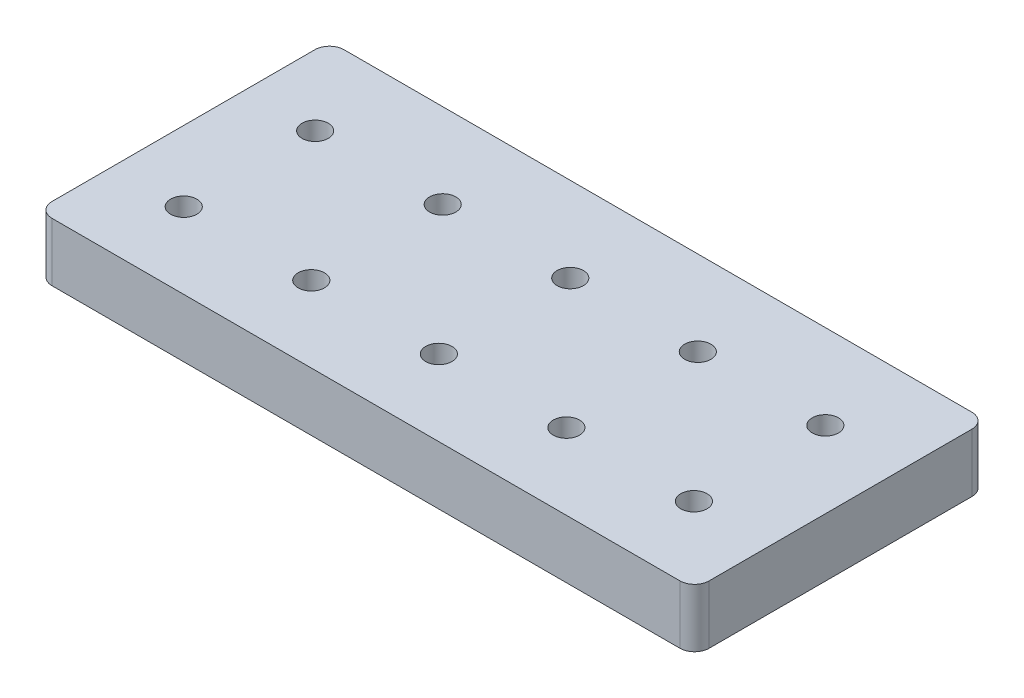
ISO-10303-21;
HEADER;
FILE_DESCRIPTION(('STEP AP214'),'2;1');
FILE_NAME('part.step','',(''),(''),'','','');
FILE_SCHEMA(('AUTOMOTIVE_DESIGN { 1 0 10303 214 1 1 1 1 }'));
ENDSEC;
DATA;
#1=APPLICATION_CONTEXT('core data for automotive mechanical design processes');
#2=APPLICATION_PROTOCOL_DEFINITION('international standard','automotive_design',2000,#1);
#3=PRODUCT_CONTEXT('',#1,'mechanical');
#4=PRODUCT('Part','Part','',(#3));
#5=PRODUCT_RELATED_PRODUCT_CATEGORY('part','',(#4));
#6=PRODUCT_DEFINITION_FORMATION('','',#4);
#7=PRODUCT_DEFINITION_CONTEXT('part definition',#1,'design');
#8=PRODUCT_DEFINITION('design','',#6,#7);
#9=PRODUCT_DEFINITION_SHAPE('','',#8);
#10=(LENGTH_UNIT() NAMED_UNIT(*) SI_UNIT(.MILLI.,.METRE.));
#11=(NAMED_UNIT(*) PLANE_ANGLE_UNIT() SI_UNIT($,.RADIAN.));
#12=(NAMED_UNIT(*) SI_UNIT($,.STERADIAN.) SOLID_ANGLE_UNIT());
#13=UNCERTAINTY_MEASURE_WITH_UNIT(LENGTH_MEASURE(1.E-05),#10,'distance_accuracy_value','');
#14=(GEOMETRIC_REPRESENTATION_CONTEXT(3) GLOBAL_UNCERTAINTY_ASSIGNED_CONTEXT((#13)) GLOBAL_UNIT_ASSIGNED_CONTEXT((#10,
#11,#12)) REPRESENTATION_CONTEXT('',''));
#15=CARTESIAN_POINT('',(0.,0.,0.));
#16=DIRECTION('',(0.,0.,1.));
#17=DIRECTION('',(1.,0.,0.));
#18=AXIS2_PLACEMENT_3D('',#15,#16,#17);
#19=CARTESIAN_POINT('',(-12.7,50.8,-12.7));
#20=DIRECTION('',(0.,-1.,0.));
#21=DIRECTION('',(0.,0.,-1.));
#22=AXIS2_PLACEMENT_3D('',#19,#20,#21);
#23=CYLINDRICAL_SURFACE('',#22,12.7);
#24=CARTESIAN_POINT('',(-12.7,0.,-12.7));
#25=DIRECTION('',(0.,1.,0.));
#26=DIRECTION('',(0.,0.,1.));
#27=AXIS2_PLACEMENT_3D('',#24,#25,#26);
#28=CIRCLE('',#27,12.7);
#29=CARTESIAN_POINT('',(-12.7000000000001,0.,0.));
#30=VERTEX_POINT('',#29);
#31=CARTESIAN_POINT('',(0.,0.,-12.7000000000001));
#32=VERTEX_POINT('',#31);
#33=EDGE_CURVE('E132',#30,#32,#28,.T.);
#34=ORIENTED_EDGE('',*,*,#33,.T.);
#35=DIRECTION('',(0.,-1.,0.));
#36=VECTOR('',#35,1.);
#37=CARTESIAN_POINT('',(0.,50.8,-12.7000000000001));
#38=LINE('',#37,#36);
#39=CARTESIAN_POINT('',(0.,50.8,-12.7000000000001));
#40=VERTEX_POINT('',#39);
#41=EDGE_CURVE('E11',#40,#32,#38,.T.);
#42=ORIENTED_EDGE('',*,*,#41,.F.);
#43=CARTESIAN_POINT('',(-12.7,50.8,-12.7));
#44=DIRECTION('',(0.,1.,0.));
#45=DIRECTION('',(0.,0.,1.));
#46=AXIS2_PLACEMENT_3D('',#43,#44,#45);
#47=CIRCLE('',#46,12.7);
#48=CARTESIAN_POINT('',(-12.7000000000001,50.8,0.));
#49=VERTEX_POINT('',#48);
#50=EDGE_CURVE('E147',#49,#40,#47,.T.);
#51=ORIENTED_EDGE('',*,*,#50,.F.);
#52=DIRECTION('',(0.,-1.,0.));
#53=VECTOR('',#52,1.);
#54=CARTESIAN_POINT('',(-12.7000000000001,50.8,0.));
#55=LINE('',#54,#53);
#56=EDGE_CURVE('E128',#49,#30,#55,.T.);
#57=ORIENTED_EDGE('',*,*,#56,.T.);
#58=EDGE_LOOP('',(#34,#42,#51,#57));
#59=FACE_BOUND('',#58,.T.);
#60=ADVANCED_FACE('F36',(#59),#23,.T.);
#61=CARTESIAN_POINT('',(0.,50.8,-12.7000000000001));
#62=DIRECTION('',(-1.,0.,0.));
#63=DIRECTION('',(0.,0.,1.));
#64=AXIS2_PLACEMENT_3D('',#61,#62,#63);
#65=PLANE('',#64);
#66=DIRECTION('',(0.,0.,-1.));
#67=VECTOR('',#66,1.);
#68=CARTESIAN_POINT('',(0.,0.,-12.7000000000001));
#69=LINE('',#68,#67);
#70=CARTESIAN_POINT('',(0.,0.,-241.3));
#71=VERTEX_POINT('',#70);
#72=EDGE_CURVE('E135',#32,#71,#69,.T.);
#73=ORIENTED_EDGE('',*,*,#72,.T.);
#74=DIRECTION('',(0.,-1.,0.));
#75=VECTOR('',#74,1.);
#76=CARTESIAN_POINT('',(0.,50.8,-241.3));
#77=LINE('',#76,#75);
#78=CARTESIAN_POINT('',(0.,50.8,-241.3));
#79=VERTEX_POINT('',#78);
#80=EDGE_CURVE('E44',#79,#71,#77,.T.);
#81=ORIENTED_EDGE('',*,*,#80,.F.);
#82=DIRECTION('',(0.,0.,-1.));
#83=VECTOR('',#82,1.);
#84=CARTESIAN_POINT('',(0.,50.8,-12.7000000000001));
#85=LINE('',#84,#83);
#86=EDGE_CURVE('E95',#40,#79,#85,.T.);
#87=ORIENTED_EDGE('',*,*,#86,.F.);
#88=ORIENTED_EDGE('',*,*,#41,.T.);
#89=EDGE_LOOP('',(#73,#81,#87,#88));
#90=FACE_BOUND('',#89,.T.);
#91=ADVANCED_FACE('F341',(#90),#65,.F.);
#92=CARTESIAN_POINT('',(-12.7,50.8,-241.3));
#93=DIRECTION('',(0.,-1.,0.));
#94=DIRECTION('',(0.,0.,-1.));
#95=AXIS2_PLACEMENT_3D('',#92,#93,#94);
#96=CYLINDRICAL_SURFACE('',#95,12.7);
#97=CARTESIAN_POINT('',(-12.7,0.,-241.3));
#98=DIRECTION('',(0.,1.,0.));
#99=DIRECTION('',(0.,0.,1.));
#100=AXIS2_PLACEMENT_3D('',#97,#98,#99);
#101=CIRCLE('',#100,12.7);
#102=CARTESIAN_POINT('',(-12.7000000000001,0.,-254.));
#103=VERTEX_POINT('',#102);
#104=EDGE_CURVE('E138',#71,#103,#101,.T.);
#105=ORIENTED_EDGE('',*,*,#104,.T.);
#106=DIRECTION('',(0.,-1.,0.));
#107=VECTOR('',#106,1.);
#108=CARTESIAN_POINT('',(-12.7000000000001,50.8,-254.));
#109=LINE('',#108,#107);
#110=CARTESIAN_POINT('',(-12.7000000000001,50.8,-254.));
#111=VERTEX_POINT('',#110);
#112=EDGE_CURVE('E154',#111,#103,#109,.T.);
#113=ORIENTED_EDGE('',*,*,#112,.F.);
#114=CARTESIAN_POINT('',(-12.7,50.8,-241.3));
#115=DIRECTION('',(0.,1.,0.));
#116=DIRECTION('',(0.,0.,1.));
#117=AXIS2_PLACEMENT_3D('',#114,#115,#116);
#118=CIRCLE('',#117,12.7);
#119=EDGE_CURVE('E162',#79,#111,#118,.T.);
#120=ORIENTED_EDGE('',*,*,#119,.F.);
#121=ORIENTED_EDGE('',*,*,#80,.T.);
#122=EDGE_LOOP('',(#105,#113,#120,#121));
#123=FACE_BOUND('',#122,.T.);
#124=ADVANCED_FACE('F160',(#123),#96,.T.);
#125=CARTESIAN_POINT('',(-12.7000000000001,50.8,-254.));
#126=DIRECTION('',(0.,0.,1.));
#127=DIRECTION('',(1.,0.,0.));
#128=AXIS2_PLACEMENT_3D('',#125,#126,#127);
#129=PLANE('',#128);
#130=DIRECTION('',(-1.,0.,0.));
#131=VECTOR('',#130,1.);
#132=CARTESIAN_POINT('',(-12.7000000000001,0.,-254.));
#133=LINE('',#132,#131);
#134=CARTESIAN_POINT('',(-558.8,0.,-254.));
#135=VERTEX_POINT('',#134);
#136=EDGE_CURVE('E140',#103,#135,#133,.T.);
#137=ORIENTED_EDGE('',*,*,#136,.T.);
#138=DIRECTION('',(0.,-1.,0.));
#139=VECTOR('',#138,1.);
#140=CARTESIAN_POINT('',(-558.8,50.8,-254.));
#141=LINE('',#140,#139);
#142=CARTESIAN_POINT('',(-558.8,50.8,-254.));
#143=VERTEX_POINT('',#142);
#144=EDGE_CURVE('E151',#143,#135,#141,.T.);
#145=ORIENTED_EDGE('',*,*,#144,.F.);
#146=DIRECTION('',(-1.,0.,0.));
#147=VECTOR('',#146,1.);
#148=CARTESIAN_POINT('',(-12.7000000000001,50.8,-254.));
#149=LINE('',#148,#147);
#150=EDGE_CURVE('E174',#111,#143,#149,.T.);
#151=ORIENTED_EDGE('',*,*,#150,.F.);
#152=ORIENTED_EDGE('',*,*,#112,.T.);
#153=EDGE_LOOP('',(#137,#145,#151,#152));
#154=FACE_BOUND('',#153,.T.);
#155=ADVANCED_FACE('F170',(#154),#129,.F.);
#156=CARTESIAN_POINT('',(-558.8,50.8,-241.3));
#157=DIRECTION('',(0.,-1.,0.));
#158=DIRECTION('',(0.,0.,-1.));
#159=AXIS2_PLACEMENT_3D('',#156,#157,#158);
#160=CYLINDRICAL_SURFACE('',#159,12.7);
#161=CARTESIAN_POINT('',(-558.8,0.,-241.3));
#162=DIRECTION('',(0.,1.,0.));
#163=DIRECTION('',(0.,0.,1.));
#164=AXIS2_PLACEMENT_3D('',#161,#162,#163);
#165=CIRCLE('',#164,12.7);
#166=CARTESIAN_POINT('',(-571.5,0.,-241.3));
#167=VERTEX_POINT('',#166);
#168=EDGE_CURVE('E142',#135,#167,#165,.T.);
#169=ORIENTED_EDGE('',*,*,#168,.T.);
#170=DIRECTION('',(0.,-1.,0.));
#171=VECTOR('',#170,1.);
#172=CARTESIAN_POINT('',(-571.5,50.8,-241.3));
#173=LINE('',#172,#171);
#174=CARTESIAN_POINT('',(-571.5,50.8,-241.3));
#175=VERTEX_POINT('',#174);
#176=EDGE_CURVE('E123',#175,#167,#173,.T.);
#177=ORIENTED_EDGE('',*,*,#176,.F.);
#178=CARTESIAN_POINT('',(-558.8,50.8,-241.3));
#179=DIRECTION('',(0.,1.,0.));
#180=DIRECTION('',(0.,0.,1.));
#181=AXIS2_PLACEMENT_3D('',#178,#179,#180);
#182=CIRCLE('',#181,12.7);
#183=EDGE_CURVE('E114',#143,#175,#182,.T.);
#184=ORIENTED_EDGE('',*,*,#183,.F.);
#185=ORIENTED_EDGE('',*,*,#144,.T.);
#186=EDGE_LOOP('',(#169,#177,#184,#185));
#187=FACE_BOUND('',#186,.T.);
#188=ADVANCED_FACE('F173',(#187),#160,.T.);
#189=CARTESIAN_POINT('',(-571.5,50.8,-12.7000000000001));
#190=DIRECTION('',(1.,0.,0.));
#191=DIRECTION('',(0.,0.,-1.));
#192=AXIS2_PLACEMENT_3D('',#189,#190,#191);
#193=PLANE('',#192);
#194=DIRECTION('',(0.,0.,1.));
#195=VECTOR('',#194,1.);
#196=CARTESIAN_POINT('',(-571.5,0.,-12.7000000000001));
#197=LINE('',#196,#195);
#198=CARTESIAN_POINT('',(-571.5,0.,-12.7000000000001));
#199=VERTEX_POINT('',#198);
#200=EDGE_CURVE('E122',#167,#199,#197,.T.);
#201=ORIENTED_EDGE('',*,*,#200,.T.);
#202=DIRECTION('',(0.,-1.,0.));
#203=VECTOR('',#202,1.);
#204=CARTESIAN_POINT('',(-571.5,50.8,-12.7000000000001));
#205=LINE('',#204,#203);
#206=CARTESIAN_POINT('',(-571.5,50.8,-12.7000000000001));
#207=VERTEX_POINT('',#206);
#208=EDGE_CURVE('E119',#207,#199,#205,.T.);
#209=ORIENTED_EDGE('',*,*,#208,.F.);
#210=DIRECTION('',(0.,0.,1.));
#211=VECTOR('',#210,1.);
#212=CARTESIAN_POINT('',(-571.5,50.8,-12.7000000000001));
#213=LINE('',#212,#211);
#214=EDGE_CURVE('E108',#175,#207,#213,.T.);
#215=ORIENTED_EDGE('',*,*,#214,.F.);
#216=ORIENTED_EDGE('',*,*,#176,.T.);
#217=EDGE_LOOP('',(#201,#209,#215,#216));
#218=FACE_BOUND('',#217,.T.);
#219=ADVANCED_FACE('F120',(#218),#193,.F.);
#220=CARTESIAN_POINT('',(-558.8,50.8,-12.7));
#221=DIRECTION('',(0.,-1.,0.));
#222=DIRECTION('',(0.,0.,-1.));
#223=AXIS2_PLACEMENT_3D('',#220,#221,#222);
#224=CYLINDRICAL_SURFACE('',#223,12.7);
#225=CARTESIAN_POINT('',(-558.8,0.,-12.7));
#226=DIRECTION('',(0.,1.,0.));
#227=DIRECTION('',(0.,0.,-1.));
#228=AXIS2_PLACEMENT_3D('',#225,#226,#227);
#229=CIRCLE('',#228,12.7);
#230=CARTESIAN_POINT('',(-558.8,0.,0.));
#231=VERTEX_POINT('',#230);
#232=EDGE_CURVE('E81',#199,#231,#229,.T.);
#233=ORIENTED_EDGE('',*,*,#232,.T.);
#234=DIRECTION('',(0.,-1.,0.));
#235=VECTOR('',#234,1.);
#236=CARTESIAN_POINT('',(-558.8,50.8,0.));
#237=LINE('',#236,#235);
#238=CARTESIAN_POINT('',(-558.8,50.8,0.));
#239=VERTEX_POINT('',#238);
#240=EDGE_CURVE('E124',#239,#231,#237,.T.);
#241=ORIENTED_EDGE('',*,*,#240,.F.);
#242=CARTESIAN_POINT('',(-558.8,50.8,-12.7));
#243=DIRECTION('',(0.,1.,0.));
#244=DIRECTION('',(0.,0.,-1.));
#245=AXIS2_PLACEMENT_3D('',#242,#243,#244);
#246=CIRCLE('',#245,12.7);
#247=EDGE_CURVE('E112',#207,#239,#246,.T.);
#248=ORIENTED_EDGE('',*,*,#247,.F.);
#249=ORIENTED_EDGE('',*,*,#208,.T.);
#250=EDGE_LOOP('',(#233,#241,#248,#249));
#251=FACE_BOUND('',#250,.T.);
#252=ADVANCED_FACE('F126',(#251),#224,.T.);
#253=CARTESIAN_POINT('',(-12.7000000000001,50.8,0.));
#254=DIRECTION('',(0.,0.,-1.));
#255=DIRECTION('',(-1.,0.,0.));
#256=AXIS2_PLACEMENT_3D('',#253,#254,#255);
#257=PLANE('',#256);
#258=DIRECTION('',(1.,0.,0.));
#259=VECTOR('',#258,1.);
#260=CARTESIAN_POINT('',(-12.7000000000001,0.,0.));
#261=LINE('',#260,#259);
#262=EDGE_CURVE('E87',#231,#30,#261,.T.);
#263=ORIENTED_EDGE('',*,*,#262,.T.);
#264=ORIENTED_EDGE('',*,*,#56,.F.);
#265=DIRECTION('',(1.,0.,0.));
#266=VECTOR('',#265,1.);
#267=CARTESIAN_POINT('',(-12.7000000000001,50.8,0.));
#268=LINE('',#267,#266);
#269=EDGE_CURVE('E52',#239,#49,#268,.T.);
#270=ORIENTED_EDGE('',*,*,#269,.F.);
#271=ORIENTED_EDGE('',*,*,#240,.T.);
#272=EDGE_LOOP('',(#263,#264,#270,#271));
#273=FACE_BOUND('',#272,.T.);
#274=ADVANCED_FACE('F348',(#273),#257,.F.);
#275=CARTESIAN_POINT('',(-12.7,50.8,-12.7));
#276=DIRECTION('',(0.,1.,0.));
#277=DIRECTION('',(0.,0.,1.));
#278=AXIS2_PLACEMENT_3D('',#275,#276,#277);
#279=PLANE('',#278);
#280=CARTESIAN_POINT('',(-177.4996116625,50.8,-180.34));
#281=DIRECTION('',(0.,-1.,0.));
#282=DIRECTION('',(0.,0.,-1.));
#283=AXIS2_PLACEMENT_3D('',#280,#281,#282);
#284=CIRCLE('',#283,11.43);
#285=CARTESIAN_POINT('',(-177.4996116625,50.8,-191.77));
#286=VERTEX_POINT('',#285);
#287=EDGE_CURVE('E243',#286,#286,#284,.T.);
#288=ORIENTED_EDGE('',*,*,#287,.T.);
#289=EDGE_LOOP('',(#288));
#290=FACE_BOUND('',#289,.T.);
#291=CARTESIAN_POINT('',(-288.428407775,50.8,-180.34));
#292=DIRECTION('',(0.,-1.,0.));
#293=DIRECTION('',(0.,0.,-1.));
#294=AXIS2_PLACEMENT_3D('',#291,#292,#293);
#295=CIRCLE('',#294,11.43);
#296=CARTESIAN_POINT('',(-288.428407775,50.8,-191.77));
#297=VERTEX_POINT('',#296);
#298=EDGE_CURVE('E291',#297,#297,#295,.T.);
#299=ORIENTED_EDGE('',*,*,#298,.T.);
#300=EDGE_LOOP('',(#299));
#301=FACE_BOUND('',#300,.T.);
#302=CARTESIAN_POINT('',(-399.3572038875,50.8,-180.34));
#303=DIRECTION('',(0.,-1.,0.));
#304=DIRECTION('',(0.,0.,-1.));
#305=AXIS2_PLACEMENT_3D('',#302,#303,#304);
#306=CIRCLE('',#305,11.43);
#307=CARTESIAN_POINT('',(-399.3572038875,50.8,-191.77));
#308=VERTEX_POINT('',#307);
#309=EDGE_CURVE('E285',#308,#308,#306,.T.);
#310=ORIENTED_EDGE('',*,*,#309,.T.);
#311=EDGE_LOOP('',(#310));
#312=FACE_BOUND('',#311,.T.);
#313=CARTESIAN_POINT('',(-510.286,50.8,-180.34));
#314=DIRECTION('',(0.,-1.,0.));
#315=DIRECTION('',(0.,0.,-1.));
#316=AXIS2_PLACEMENT_3D('',#313,#314,#315);
#317=CIRCLE('',#316,11.43);
#318=CARTESIAN_POINT('',(-510.286,50.8,-191.77));
#319=VERTEX_POINT('',#318);
#320=EDGE_CURVE('E279',#319,#319,#317,.T.);
#321=ORIENTED_EDGE('',*,*,#320,.T.);
#322=EDGE_LOOP('',(#321));
#323=FACE_BOUND('',#322,.T.);
#324=CARTESIAN_POINT('',(-510.286,50.8,-66.0400000000003));
#325=DIRECTION('',(0.,-1.,0.));
#326=DIRECTION('',(0.,0.,1.));
#327=AXIS2_PLACEMENT_3D('',#324,#325,#326);
#328=CIRCLE('',#327,11.43);
#329=CARTESIAN_POINT('',(-510.286,50.8,-54.6100000000003));
#330=VERTEX_POINT('',#329);
#331=EDGE_CURVE('E273',#330,#330,#328,.T.);
#332=ORIENTED_EDGE('',*,*,#331,.T.);
#333=EDGE_LOOP('',(#332));
#334=FACE_BOUND('',#333,.T.);
#335=CARTESIAN_POINT('',(-399.3572038875,50.8,-66.0400000000003));
#336=DIRECTION('',(0.,-1.,0.));
#337=DIRECTION('',(0.,0.,1.));
#338=AXIS2_PLACEMENT_3D('',#335,#336,#337);
#339=CIRCLE('',#338,11.43);
#340=CARTESIAN_POINT('',(-399.3572038875,50.8,-54.6100000000003));
#341=VERTEX_POINT('',#340);
#342=EDGE_CURVE('E267',#341,#341,#339,.T.);
#343=ORIENTED_EDGE('',*,*,#342,.T.);
#344=EDGE_LOOP('',(#343));
#345=FACE_BOUND('',#344,.T.);
#346=CARTESIAN_POINT('',(-288.428407775,50.8,-66.0400000000003));
#347=DIRECTION('',(0.,-1.,0.));
#348=DIRECTION('',(0.,0.,1.));
#349=AXIS2_PLACEMENT_3D('',#346,#347,#348);
#350=CIRCLE('',#349,11.43);
#351=CARTESIAN_POINT('',(-288.428407775,50.8,-54.6100000000003));
#352=VERTEX_POINT('',#351);
#353=EDGE_CURVE('E261',#352,#352,#350,.T.);
#354=ORIENTED_EDGE('',*,*,#353,.T.);
#355=EDGE_LOOP('',(#354));
#356=FACE_BOUND('',#355,.T.);
#357=CARTESIAN_POINT('',(-177.4996116625,50.8,-66.0400000000003));
#358=DIRECTION('',(0.,-1.,0.));
#359=DIRECTION('',(0.,0.,1.));
#360=AXIS2_PLACEMENT_3D('',#357,#358,#359);
#361=CIRCLE('',#360,11.43);
#362=CARTESIAN_POINT('',(-177.4996116625,50.8,-54.6100000000003));
#363=VERTEX_POINT('',#362);
#364=EDGE_CURVE('E255',#363,#363,#361,.T.);
#365=ORIENTED_EDGE('',*,*,#364,.T.);
#366=EDGE_LOOP('',(#365));
#367=FACE_BOUND('',#366,.T.);
#368=CARTESIAN_POINT('',(-66.5708155500001,50.8,-66.0400000000003));
#369=DIRECTION('',(0.,-1.,0.));
#370=DIRECTION('',(0.,0.,1.));
#371=AXIS2_PLACEMENT_3D('',#368,#369,#370);
#372=CIRCLE('',#371,11.43);
#373=CARTESIAN_POINT('',(-66.5708155500001,50.8,-54.6100000000003));
#374=VERTEX_POINT('',#373);
#375=EDGE_CURVE('E249',#374,#374,#372,.T.);
#376=ORIENTED_EDGE('',*,*,#375,.T.);
#377=EDGE_LOOP('',(#376));
#378=FACE_BOUND('',#377,.T.);
#379=CARTESIAN_POINT('',(-66.5708155500001,50.8,-180.34));
#380=DIRECTION('',(0.,-1.,0.));
#381=DIRECTION('',(0.,0.,-1.));
#382=AXIS2_PLACEMENT_3D('',#379,#380,#381);
#383=CIRCLE('',#382,11.43);
#384=CARTESIAN_POINT('',(-66.5708155500001,50.8,-191.77));
#385=VERTEX_POINT('',#384);
#386=EDGE_CURVE('E210',#385,#385,#383,.T.);
#387=ORIENTED_EDGE('',*,*,#386,.T.);
#388=EDGE_LOOP('',(#387));
#389=FACE_BOUND('',#388,.T.);
#390=ORIENTED_EDGE('',*,*,#50,.T.);
#391=ORIENTED_EDGE('',*,*,#86,.T.);
#392=ORIENTED_EDGE('',*,*,#119,.T.);
#393=ORIENTED_EDGE('',*,*,#150,.T.);
#394=ORIENTED_EDGE('',*,*,#183,.T.);
#395=ORIENTED_EDGE('',*,*,#214,.T.);
#396=ORIENTED_EDGE('',*,*,#247,.T.);
#397=ORIENTED_EDGE('',*,*,#269,.T.);
#398=EDGE_LOOP('',(#390,#391,#392,#393,#394,#395,#396,#397));
#399=FACE_BOUND('',#398,.T.);
#400=ADVANCED_FACE('F110',(#290,#301,#312,#323,#334,#345,#356,#367,#378,#389,#399),#279,.T.);
#401=CARTESIAN_POINT('',(-12.7,0.,-12.7));
#402=DIRECTION('',(0.,1.,0.));
#403=DIRECTION('',(0.,0.,1.));
#404=AXIS2_PLACEMENT_3D('',#401,#402,#403);
#405=PLANE('',#404);
#406=CARTESIAN_POINT('',(-510.286,0.,-66.0400000000002));
#407=DIRECTION('',(0.,1.,0.));
#408=DIRECTION('',(0.,0.,1.));
#409=AXIS2_PLACEMENT_3D('',#406,#407,#408);
#410=CIRCLE('',#409,50.8);
#411=CARTESIAN_POINT('',(-510.286,0.,-15.2400000000002));
#412=VERTEX_POINT('',#411);
#413=EDGE_CURVE('E199',#412,#412,#410,.T.);
#414=ORIENTED_EDGE('',*,*,#413,.T.);
#415=EDGE_LOOP('',(#414));
#416=FACE_BOUND('',#415,.T.);
#417=CARTESIAN_POINT('',(-66.57081555,0.,-66.0400000000002));
#418=DIRECTION('',(0.,1.,0.));
#419=DIRECTION('',(0.,0.,1.));
#420=AXIS2_PLACEMENT_3D('',#417,#418,#419);
#421=CIRCLE('',#420,50.8);
#422=CARTESIAN_POINT('',(-66.57081555,0.,-15.2400000000002));
#423=VERTEX_POINT('',#422);
#424=EDGE_CURVE('E235',#423,#423,#421,.T.);
#425=ORIENTED_EDGE('',*,*,#424,.T.);
#426=EDGE_LOOP('',(#425));
#427=FACE_BOUND('',#426,.T.);
#428=CARTESIAN_POINT('',(-399.3572038875,0.,-66.0400000000002));
#429=DIRECTION('',(0.,1.,0.));
#430=DIRECTION('',(0.,0.,1.));
#431=AXIS2_PLACEMENT_3D('',#428,#429,#430);
#432=CIRCLE('',#431,50.8);
#433=CARTESIAN_POINT('',(-399.3572038875,0.,-15.2400000000002));
#434=VERTEX_POINT('',#433);
#435=EDGE_CURVE('E218',#434,#434,#432,.T.);
#436=ORIENTED_EDGE('',*,*,#435,.T.);
#437=EDGE_LOOP('',(#436));
#438=FACE_BOUND('',#437,.T.);
#439=CARTESIAN_POINT('',(-288.428407775,0.,-66.0400000000002));
#440=DIRECTION('',(0.,1.,0.));
#441=DIRECTION('',(0.,0.,1.));
#442=AXIS2_PLACEMENT_3D('',#439,#440,#441);
#443=CIRCLE('',#442,50.8);
#444=CARTESIAN_POINT('',(-288.428407775,0.,-15.2400000000002));
#445=VERTEX_POINT('',#444);
#446=EDGE_CURVE('E225',#445,#445,#443,.T.);
#447=ORIENTED_EDGE('',*,*,#446,.T.);
#448=EDGE_LOOP('',(#447));
#449=FACE_BOUND('',#448,.T.);
#450=CARTESIAN_POINT('',(-399.3572038875,0.,-180.34));
#451=DIRECTION('',(0.,1.,0.));
#452=DIRECTION('',(0.,0.,1.));
#453=AXIS2_PLACEMENT_3D('',#450,#451,#452);
#454=CIRCLE('',#453,50.8);
#455=CARTESIAN_POINT('',(-399.3572038875,0.,-129.54));
#456=VERTEX_POINT('',#455);
#457=EDGE_CURVE('E200',#456,#456,#454,.T.);
#458=ORIENTED_EDGE('',*,*,#457,.T.);
#459=EDGE_LOOP('',(#458));
#460=FACE_BOUND('',#459,.T.);
#461=CARTESIAN_POINT('',(-510.286,0.,-180.34));
#462=DIRECTION('',(0.,1.,0.));
#463=DIRECTION('',(0.,0.,1.));
#464=AXIS2_PLACEMENT_3D('',#461,#462,#463);
#465=CIRCLE('',#464,50.8);
#466=CARTESIAN_POINT('',(-510.286,0.,-129.54));
#467=VERTEX_POINT('',#466);
#468=EDGE_CURVE('E213',#467,#467,#465,.T.);
#469=ORIENTED_EDGE('',*,*,#468,.T.);
#470=EDGE_LOOP('',(#469));
#471=FACE_BOUND('',#470,.T.);
#472=CARTESIAN_POINT('',(-66.5708155500001,0.,-180.34));
#473=DIRECTION('',(0.,1.,0.));
#474=DIRECTION('',(0.,0.,1.));
#475=AXIS2_PLACEMENT_3D('',#472,#473,#474);
#476=CIRCLE('',#475,50.8);
#477=CARTESIAN_POINT('',(-66.5708155500001,0.,-129.54));
#478=VERTEX_POINT('',#477);
#479=EDGE_CURVE('E206',#478,#478,#476,.T.);
#480=ORIENTED_EDGE('',*,*,#479,.T.);
#481=EDGE_LOOP('',(#480));
#482=FACE_BOUND('',#481,.T.);
#483=CARTESIAN_POINT('',(-288.428407775,0.,-180.34));
#484=DIRECTION('',(0.,1.,0.));
#485=DIRECTION('',(0.,0.,1.));
#486=AXIS2_PLACEMENT_3D('',#483,#484,#485);
#487=CIRCLE('',#486,50.8);
#488=CARTESIAN_POINT('',(-288.428407775,0.,-129.54));
#489=VERTEX_POINT('',#488);
#490=EDGE_CURVE('E186',#489,#489,#487,.T.);
#491=ORIENTED_EDGE('',*,*,#490,.T.);
#492=EDGE_LOOP('',(#491));
#493=FACE_BOUND('',#492,.T.);
#494=CARTESIAN_POINT('',(-177.4996116625,0.,-180.34));
#495=DIRECTION('',(0.,1.,0.));
#496=DIRECTION('',(0.,0.,1.));
#497=AXIS2_PLACEMENT_3D('',#494,#495,#496);
#498=CIRCLE('',#497,50.8);
#499=CARTESIAN_POINT('',(-177.4996116625,0.,-129.54));
#500=VERTEX_POINT('',#499);
#501=EDGE_CURVE('E193',#500,#500,#498,.T.);
#502=ORIENTED_EDGE('',*,*,#501,.T.);
#503=EDGE_LOOP('',(#502));
#504=FACE_BOUND('',#503,.T.);
#505=CARTESIAN_POINT('',(-177.4996116625,0.,-66.0400000000002));
#506=DIRECTION('',(0.,1.,0.));
#507=DIRECTION('',(0.,0.,1.));
#508=AXIS2_PLACEMENT_3D('',#505,#506,#507);
#509=CIRCLE('',#508,50.8);
#510=CARTESIAN_POINT('',(-177.4996116625,0.,-15.2400000000002));
#511=VERTEX_POINT('',#510);
#512=EDGE_CURVE('E180',#511,#511,#509,.T.);
#513=ORIENTED_EDGE('',*,*,#512,.T.);
#514=EDGE_LOOP('',(#513));
#515=FACE_BOUND('',#514,.T.);
#516=ORIENTED_EDGE('',*,*,#33,.F.);
#517=ORIENTED_EDGE('',*,*,#262,.F.);
#518=ORIENTED_EDGE('',*,*,#232,.F.);
#519=ORIENTED_EDGE('',*,*,#200,.F.);
#520=ORIENTED_EDGE('',*,*,#168,.F.);
#521=ORIENTED_EDGE('',*,*,#136,.F.);
#522=ORIENTED_EDGE('',*,*,#104,.F.);
#523=ORIENTED_EDGE('',*,*,#72,.F.);
#524=EDGE_LOOP('',(#516,#517,#518,#519,#520,#521,#522,#523));
#525=FACE_BOUND('',#524,.T.);
#526=ADVANCED_FACE('F166',(#416,#427,#438,#449,#460,#471,#482,#493,#504,#515,#525),#405,.F.);
#527=CARTESIAN_POINT('',(-177.4996116625,10.16,-66.0400000000002));
#528=DIRECTION('',(0.,-1.,0.));
#529=DIRECTION('',(0.,0.,-1.));
#530=AXIS2_PLACEMENT_3D('',#527,#528,#529);
#531=CYLINDRICAL_SURFACE('',#530,50.8);
#532=CARTESIAN_POINT('',(-177.4996116625,10.16,-66.0400000000002));
#533=DIRECTION('',(0.,1.,0.));
#534=DIRECTION('',(0.,0.,1.));
#535=AXIS2_PLACEMENT_3D('',#532,#533,#534);
#536=CIRCLE('',#535,50.8);
#537=CARTESIAN_POINT('',(-177.4996116625,10.16,-15.2400000000002));
#538=VERTEX_POINT('',#537);
#539=EDGE_CURVE('E136',#538,#538,#536,.T.);
#540=ORIENTED_EDGE('',*,*,#539,.T.);
#541=EDGE_LOOP('',(#540));
#542=FACE_BOUND('',#541,.T.);
#543=ORIENTED_EDGE('',*,*,#512,.F.);
#544=EDGE_LOOP('',(#543));
#545=FACE_BOUND('',#544,.T.);
#546=ADVANCED_FACE('F326',(#542,#545),#531,.F.);
#547=CARTESIAN_POINT('',(-177.4996116625,10.16,-66.0400000000002));
#548=DIRECTION('',(0.,1.,0.));
#549=DIRECTION('',(0.,0.,1.));
#550=AXIS2_PLACEMENT_3D('',#547,#548,#549);
#551=PLANE('',#550);
#552=CARTESIAN_POINT('',(-177.4996116625,10.16,-66.0400000000003));
#553=DIRECTION('',(0.,-1.,0.));
#554=DIRECTION('',(0.,0.,1.));
#555=AXIS2_PLACEMENT_3D('',#552,#553,#554);
#556=CIRCLE('',#555,11.43);
#557=CARTESIAN_POINT('',(-177.4996116625,10.16,-54.6100000000003));
#558=VERTEX_POINT('',#557);
#559=EDGE_CURVE('E252',#558,#558,#556,.T.);
#560=ORIENTED_EDGE('',*,*,#559,.F.);
#561=EDGE_LOOP('',(#560));
#562=FACE_BOUND('',#561,.T.);
#563=ORIENTED_EDGE('',*,*,#539,.F.);
#564=EDGE_LOOP('',(#563));
#565=FACE_BOUND('',#564,.T.);
#566=ADVANCED_FACE('F320',(#562,#565),#551,.F.);
#567=CARTESIAN_POINT('',(-177.4996116625,10.16,-180.34));
#568=DIRECTION('',(0.,-1.,0.));
#569=DIRECTION('',(0.,0.,-1.));
#570=AXIS2_PLACEMENT_3D('',#567,#568,#569);
#571=CYLINDRICAL_SURFACE('',#570,50.8);
#572=CARTESIAN_POINT('',(-177.4996116625,10.16,-180.34));
#573=DIRECTION('',(0.,1.,0.));
#574=DIRECTION('',(0.,0.,1.));
#575=AXIS2_PLACEMENT_3D('',#572,#573,#574);
#576=CIRCLE('',#575,50.8);
#577=CARTESIAN_POINT('',(-177.4996116625,10.16,-129.54));
#578=VERTEX_POINT('',#577);
#579=EDGE_CURVE('E196',#578,#578,#576,.T.);
#580=ORIENTED_EDGE('',*,*,#579,.T.);
#581=EDGE_LOOP('',(#580));
#582=FACE_BOUND('',#581,.T.);
#583=ORIENTED_EDGE('',*,*,#501,.F.);
#584=EDGE_LOOP('',(#583));
#585=FACE_BOUND('',#584,.T.);
#586=ADVANCED_FACE('F314',(#582,#585),#571,.F.);
#587=CARTESIAN_POINT('',(-177.4996116625,10.16,-180.34));
#588=DIRECTION('',(0.,1.,0.));
#589=DIRECTION('',(0.,0.,1.));
#590=AXIS2_PLACEMENT_3D('',#587,#588,#589);
#591=PLANE('',#590);
#592=CARTESIAN_POINT('',(-177.4996116625,10.16,-180.34));
#593=DIRECTION('',(0.,-1.,0.));
#594=DIRECTION('',(0.,0.,-1.));
#595=AXIS2_PLACEMENT_3D('',#592,#593,#594);
#596=CIRCLE('',#595,11.43);
#597=CARTESIAN_POINT('',(-177.4996116625,10.16,-191.77));
#598=VERTEX_POINT('',#597);
#599=EDGE_CURVE('E294',#598,#598,#596,.T.);
#600=ORIENTED_EDGE('',*,*,#599,.F.);
#601=EDGE_LOOP('',(#600));
#602=FACE_BOUND('',#601,.T.);
#603=ORIENTED_EDGE('',*,*,#579,.F.);
#604=EDGE_LOOP('',(#603));
#605=FACE_BOUND('',#604,.T.);
#606=ADVANCED_FACE('F310',(#602,#605),#591,.F.);
#607=CARTESIAN_POINT('',(-288.428407775,10.16,-180.34));
#608=DIRECTION('',(0.,-1.,0.));
#609=DIRECTION('',(0.,0.,-1.));
#610=AXIS2_PLACEMENT_3D('',#607,#608,#609);
#611=CYLINDRICAL_SURFACE('',#610,50.8);
#612=CARTESIAN_POINT('',(-288.428407775,10.16,-180.34));
#613=DIRECTION('',(0.,1.,0.));
#614=DIRECTION('',(0.,0.,1.));
#615=AXIS2_PLACEMENT_3D('',#612,#613,#614);
#616=CIRCLE('',#615,50.8);
#617=CARTESIAN_POINT('',(-288.428407775,10.16,-129.54));
#618=VERTEX_POINT('',#617);
#619=EDGE_CURVE('E189',#618,#618,#616,.T.);
#620=ORIENTED_EDGE('',*,*,#619,.T.);
#621=EDGE_LOOP('',(#620));
#622=FACE_BOUND('',#621,.T.);
#623=ORIENTED_EDGE('',*,*,#490,.F.);
#624=EDGE_LOOP('',(#623));
#625=FACE_BOUND('',#624,.T.);
#626=ADVANCED_FACE('F313',(#622,#625),#611,.F.);
#627=CARTESIAN_POINT('',(-288.428407775,10.16,-180.34));
#628=DIRECTION('',(0.,1.,0.));
#629=DIRECTION('',(0.,0.,1.));
#630=AXIS2_PLACEMENT_3D('',#627,#628,#629);
#631=PLANE('',#630);
#632=CARTESIAN_POINT('',(-288.428407775,10.16,-180.34));
#633=DIRECTION('',(0.,-1.,0.));
#634=DIRECTION('',(0.,0.,-1.));
#635=AXIS2_PLACEMENT_3D('',#632,#633,#634);
#636=CIRCLE('',#635,11.43);
#637=CARTESIAN_POINT('',(-288.428407775,10.16,-191.77));
#638=VERTEX_POINT('',#637);
#639=EDGE_CURVE('E288',#638,#638,#636,.T.);
#640=ORIENTED_EDGE('',*,*,#639,.F.);
#641=EDGE_LOOP('',(#640));
#642=FACE_BOUND('',#641,.T.);
#643=ORIENTED_EDGE('',*,*,#619,.F.);
#644=EDGE_LOOP('',(#643));
#645=FACE_BOUND('',#644,.T.);
#646=ADVANCED_FACE('F416',(#642,#645),#631,.F.);
#647=CARTESIAN_POINT('',(-66.5708155500001,10.16,-180.34));
#648=DIRECTION('',(0.,-1.,0.));
#649=DIRECTION('',(0.,0.,-1.));
#650=AXIS2_PLACEMENT_3D('',#647,#648,#649);
#651=CYLINDRICAL_SURFACE('',#650,50.8);
#652=CARTESIAN_POINT('',(-66.5708155500001,10.16,-180.34));
#653=DIRECTION('',(0.,1.,0.));
#654=DIRECTION('',(0.,0.,1.));
#655=AXIS2_PLACEMENT_3D('',#652,#653,#654);
#656=CIRCLE('',#655,50.8);
#657=CARTESIAN_POINT('',(-66.5708155500001,10.16,-129.54));
#658=VERTEX_POINT('',#657);
#659=EDGE_CURVE('E209',#658,#658,#656,.T.);
#660=ORIENTED_EDGE('',*,*,#659,.T.);
#661=EDGE_LOOP('',(#660));
#662=FACE_BOUND('',#661,.T.);
#663=ORIENTED_EDGE('',*,*,#479,.F.);
#664=EDGE_LOOP('',(#663));
#665=FACE_BOUND('',#664,.T.);
#666=ADVANCED_FACE('F424',(#662,#665),#651,.F.);
#667=CARTESIAN_POINT('',(-66.5708155500001,10.16,-180.34));
#668=DIRECTION('',(0.,1.,0.));
#669=DIRECTION('',(0.,0.,1.));
#670=AXIS2_PLACEMENT_3D('',#667,#668,#669);
#671=PLANE('',#670);
#672=CARTESIAN_POINT('',(-66.5708155500001,10.16,-180.34));
#673=DIRECTION('',(0.,-1.,0.));
#674=DIRECTION('',(0.,0.,-1.));
#675=AXIS2_PLACEMENT_3D('',#672,#673,#674);
#676=CIRCLE('',#675,11.43);
#677=CARTESIAN_POINT('',(-66.5708155500001,10.16,-191.77));
#678=VERTEX_POINT('',#677);
#679=EDGE_CURVE('E240',#678,#678,#676,.T.);
#680=ORIENTED_EDGE('',*,*,#679,.F.);
#681=EDGE_LOOP('',(#680));
#682=FACE_BOUND('',#681,.T.);
#683=ORIENTED_EDGE('',*,*,#659,.F.);
#684=EDGE_LOOP('',(#683));
#685=FACE_BOUND('',#684,.T.);
#686=ADVANCED_FACE('F429',(#682,#685),#671,.F.);
#687=CARTESIAN_POINT('',(-510.286,10.16,-180.34));
#688=DIRECTION('',(0.,-1.,0.));
#689=DIRECTION('',(0.,0.,-1.));
#690=AXIS2_PLACEMENT_3D('',#687,#688,#689);
#691=CYLINDRICAL_SURFACE('',#690,50.8);
#692=CARTESIAN_POINT('',(-510.286,10.16,-180.34));
#693=DIRECTION('',(0.,1.,0.));
#694=DIRECTION('',(0.,0.,1.));
#695=AXIS2_PLACEMENT_3D('',#692,#693,#694);
#696=CIRCLE('',#695,50.8);
#697=CARTESIAN_POINT('',(-510.286,10.16,-129.54));
#698=VERTEX_POINT('',#697);
#699=EDGE_CURVE('E203',#698,#698,#696,.T.);
#700=ORIENTED_EDGE('',*,*,#699,.T.);
#701=EDGE_LOOP('',(#700));
#702=FACE_BOUND('',#701,.T.);
#703=ORIENTED_EDGE('',*,*,#468,.F.);
#704=EDGE_LOOP('',(#703));
#705=FACE_BOUND('',#704,.T.);
#706=ADVANCED_FACE('F437',(#702,#705),#691,.F.);
#707=CARTESIAN_POINT('',(-510.286,10.16,-180.34));
#708=DIRECTION('',(0.,1.,0.));
#709=DIRECTION('',(0.,0.,1.));
#710=AXIS2_PLACEMENT_3D('',#707,#708,#709);
#711=PLANE('',#710);
#712=CARTESIAN_POINT('',(-510.286,10.16,-180.34));
#713=DIRECTION('',(0.,-1.,0.));
#714=DIRECTION('',(0.,0.,-1.));
#715=AXIS2_PLACEMENT_3D('',#712,#713,#714);
#716=CIRCLE('',#715,11.43);
#717=CARTESIAN_POINT('',(-510.286,10.16,-191.77));
#718=VERTEX_POINT('',#717);
#719=EDGE_CURVE('E276',#718,#718,#716,.T.);
#720=ORIENTED_EDGE('',*,*,#719,.F.);
#721=EDGE_LOOP('',(#720));
#722=FACE_BOUND('',#721,.T.);
#723=ORIENTED_EDGE('',*,*,#699,.F.);
#724=EDGE_LOOP('',(#723));
#725=FACE_BOUND('',#724,.T.);
#726=ADVANCED_FACE('F442',(#722,#725),#711,.F.);
#727=CARTESIAN_POINT('',(-399.3572038875,10.16,-180.34));
#728=DIRECTION('',(0.,-1.,0.));
#729=DIRECTION('',(0.,0.,-1.));
#730=AXIS2_PLACEMENT_3D('',#727,#728,#729);
#731=CYLINDRICAL_SURFACE('',#730,50.8);
#732=CARTESIAN_POINT('',(-399.3572038875,10.16,-180.34));
#733=DIRECTION('',(0.,1.,0.));
#734=DIRECTION('',(0.,0.,1.));
#735=AXIS2_PLACEMENT_3D('',#732,#733,#734);
#736=CIRCLE('',#735,50.8);
#737=CARTESIAN_POINT('',(-399.3572038875,10.16,-129.54));
#738=VERTEX_POINT('',#737);
#739=EDGE_CURVE('E190',#738,#738,#736,.T.);
#740=ORIENTED_EDGE('',*,*,#739,.T.);
#741=EDGE_LOOP('',(#740));
#742=FACE_BOUND('',#741,.T.);
#743=ORIENTED_EDGE('',*,*,#457,.F.);
#744=EDGE_LOOP('',(#743));
#745=FACE_BOUND('',#744,.T.);
#746=ADVANCED_FACE('F450',(#742,#745),#731,.F.);
#747=CARTESIAN_POINT('',(-399.3572038875,10.16,-180.34));
#748=DIRECTION('',(0.,1.,0.));
#749=DIRECTION('',(0.,0.,1.));
#750=AXIS2_PLACEMENT_3D('',#747,#748,#749);
#751=PLANE('',#750);
#752=CARTESIAN_POINT('',(-399.3572038875,10.16,-180.34));
#753=DIRECTION('',(0.,-1.,0.));
#754=DIRECTION('',(0.,0.,-1.));
#755=AXIS2_PLACEMENT_3D('',#752,#753,#754);
#756=CIRCLE('',#755,11.43);
#757=CARTESIAN_POINT('',(-399.3572038875,10.16,-191.77));
#758=VERTEX_POINT('',#757);
#759=EDGE_CURVE('E282',#758,#758,#756,.T.);
#760=ORIENTED_EDGE('',*,*,#759,.F.);
#761=EDGE_LOOP('',(#760));
#762=FACE_BOUND('',#761,.T.);
#763=ORIENTED_EDGE('',*,*,#739,.F.);
#764=EDGE_LOOP('',(#763));
#765=FACE_BOUND('',#764,.T.);
#766=ADVANCED_FACE('F455',(#762,#765),#751,.F.);
#767=CARTESIAN_POINT('',(-288.428407775,10.16,-66.0400000000002));
#768=DIRECTION('',(0.,-1.,0.));
#769=DIRECTION('',(0.,0.,-1.));
#770=AXIS2_PLACEMENT_3D('',#767,#768,#769);
#771=CYLINDRICAL_SURFACE('',#770,50.8);
#772=CARTESIAN_POINT('',(-288.428407775,10.16,-66.0400000000002));
#773=DIRECTION('',(0.,1.,0.));
#774=DIRECTION('',(0.,0.,1.));
#775=AXIS2_PLACEMENT_3D('',#772,#773,#774);
#776=CIRCLE('',#775,50.8);
#777=CARTESIAN_POINT('',(-288.428407775,10.16,-15.2400000000002));
#778=VERTEX_POINT('',#777);
#779=EDGE_CURVE('E183',#778,#778,#776,.T.);
#780=ORIENTED_EDGE('',*,*,#779,.T.);
#781=EDGE_LOOP('',(#780));
#782=FACE_BOUND('',#781,.T.);
#783=ORIENTED_EDGE('',*,*,#446,.F.);
#784=EDGE_LOOP('',(#783));
#785=FACE_BOUND('',#784,.T.);
#786=ADVANCED_FACE('F463',(#782,#785),#771,.F.);
#787=CARTESIAN_POINT('',(-288.428407775,10.16,-66.0400000000002));
#788=DIRECTION('',(0.,1.,0.));
#789=DIRECTION('',(0.,0.,1.));
#790=AXIS2_PLACEMENT_3D('',#787,#788,#789);
#791=PLANE('',#790);
#792=CARTESIAN_POINT('',(-288.428407775,10.16,-66.0400000000003));
#793=DIRECTION('',(0.,-1.,0.));
#794=DIRECTION('',(0.,0.,1.));
#795=AXIS2_PLACEMENT_3D('',#792,#793,#794);
#796=CIRCLE('',#795,11.43);
#797=CARTESIAN_POINT('',(-288.428407775,10.16,-54.6100000000003));
#798=VERTEX_POINT('',#797);
#799=EDGE_CURVE('E258',#798,#798,#796,.T.);
#800=ORIENTED_EDGE('',*,*,#799,.F.);
#801=EDGE_LOOP('',(#800));
#802=FACE_BOUND('',#801,.T.);
#803=ORIENTED_EDGE('',*,*,#779,.F.);
#804=EDGE_LOOP('',(#803));
#805=FACE_BOUND('',#804,.T.);
#806=ADVANCED_FACE('F468',(#802,#805),#791,.F.);
#807=CARTESIAN_POINT('',(-399.3572038875,10.16,-66.0400000000002));
#808=DIRECTION('',(0.,-1.,0.));
#809=DIRECTION('',(0.,0.,-1.));
#810=AXIS2_PLACEMENT_3D('',#807,#808,#809);
#811=CYLINDRICAL_SURFACE('',#810,50.8);
#812=CARTESIAN_POINT('',(-399.3572038875,10.16,-66.0400000000002));
#813=DIRECTION('',(0.,1.,0.));
#814=DIRECTION('',(0.,0.,1.));
#815=AXIS2_PLACEMENT_3D('',#812,#813,#814);
#816=CIRCLE('',#815,50.8);
#817=CARTESIAN_POINT('',(-399.3572038875,10.16,-15.2400000000002));
#818=VERTEX_POINT('',#817);
#819=EDGE_CURVE('E221',#818,#818,#816,.T.);
#820=ORIENTED_EDGE('',*,*,#819,.T.);
#821=EDGE_LOOP('',(#820));
#822=FACE_BOUND('',#821,.T.);
#823=ORIENTED_EDGE('',*,*,#435,.F.);
#824=EDGE_LOOP('',(#823));
#825=FACE_BOUND('',#824,.T.);
#826=ADVANCED_FACE('F476',(#822,#825),#811,.F.);
#827=CARTESIAN_POINT('',(-399.3572038875,10.16,-66.0400000000002));
#828=DIRECTION('',(0.,1.,0.));
#829=DIRECTION('',(0.,0.,1.));
#830=AXIS2_PLACEMENT_3D('',#827,#828,#829);
#831=PLANE('',#830);
#832=CARTESIAN_POINT('',(-399.3572038875,10.16,-66.0400000000003));
#833=DIRECTION('',(0.,-1.,0.));
#834=DIRECTION('',(0.,0.,1.));
#835=AXIS2_PLACEMENT_3D('',#832,#833,#834);
#836=CIRCLE('',#835,11.43);
#837=CARTESIAN_POINT('',(-399.3572038875,10.16,-54.6100000000003));
#838=VERTEX_POINT('',#837);
#839=EDGE_CURVE('E264',#838,#838,#836,.T.);
#840=ORIENTED_EDGE('',*,*,#839,.F.);
#841=EDGE_LOOP('',(#840));
#842=FACE_BOUND('',#841,.T.);
#843=ORIENTED_EDGE('',*,*,#819,.F.);
#844=EDGE_LOOP('',(#843));
#845=FACE_BOUND('',#844,.T.);
#846=ADVANCED_FACE('F481',(#842,#845),#831,.F.);
#847=CARTESIAN_POINT('',(-66.57081555,10.16,-66.0400000000002));
#848=DIRECTION('',(0.,-1.,0.));
#849=DIRECTION('',(0.,0.,-1.));
#850=AXIS2_PLACEMENT_3D('',#847,#848,#849);
#851=CYLINDRICAL_SURFACE('',#850,50.8);
#852=CARTESIAN_POINT('',(-66.57081555,10.16,-66.0400000000002));
#853=DIRECTION('',(0.,1.,0.));
#854=DIRECTION('',(0.,0.,1.));
#855=AXIS2_PLACEMENT_3D('',#852,#853,#854);
#856=CIRCLE('',#855,50.8);
#857=CARTESIAN_POINT('',(-66.57081555,10.16,-15.2400000000002));
#858=VERTEX_POINT('',#857);
#859=EDGE_CURVE('E222',#858,#858,#856,.T.);
#860=ORIENTED_EDGE('',*,*,#859,.T.);
#861=EDGE_LOOP('',(#860));
#862=FACE_BOUND('',#861,.T.);
#863=ORIENTED_EDGE('',*,*,#424,.F.);
#864=EDGE_LOOP('',(#863));
#865=FACE_BOUND('',#864,.T.);
#866=ADVANCED_FACE('F489',(#862,#865),#851,.F.);
#867=CARTESIAN_POINT('',(-66.57081555,10.16,-66.0400000000002));
#868=DIRECTION('',(0.,1.,0.));
#869=DIRECTION('',(0.,0.,1.));
#870=AXIS2_PLACEMENT_3D('',#867,#868,#869);
#871=PLANE('',#870);
#872=CARTESIAN_POINT('',(-66.5708155500001,10.16,-66.0400000000003));
#873=DIRECTION('',(0.,-1.,0.));
#874=DIRECTION('',(0.,0.,1.));
#875=AXIS2_PLACEMENT_3D('',#872,#873,#874);
#876=CIRCLE('',#875,11.43);
#877=CARTESIAN_POINT('',(-66.5708155500001,10.16,-54.6100000000003));
#878=VERTEX_POINT('',#877);
#879=EDGE_CURVE('E246',#878,#878,#876,.T.);
#880=ORIENTED_EDGE('',*,*,#879,.F.);
#881=EDGE_LOOP('',(#880));
#882=FACE_BOUND('',#881,.T.);
#883=ORIENTED_EDGE('',*,*,#859,.F.);
#884=EDGE_LOOP('',(#883));
#885=FACE_BOUND('',#884,.T.);
#886=ADVANCED_FACE('F494',(#882,#885),#871,.F.);
#887=CARTESIAN_POINT('',(-510.286,10.16,-66.0400000000002));
#888=DIRECTION('',(0.,-1.,0.));
#889=DIRECTION('',(0.,0.,-1.));
#890=AXIS2_PLACEMENT_3D('',#887,#888,#889);
#891=CYLINDRICAL_SURFACE('',#890,50.8);
#892=CARTESIAN_POINT('',(-510.286,10.16,-66.0400000000002));
#893=DIRECTION('',(0.,1.,0.));
#894=DIRECTION('',(0.,0.,1.));
#895=AXIS2_PLACEMENT_3D('',#892,#893,#894);
#896=CIRCLE('',#895,50.8);
#897=CARTESIAN_POINT('',(-510.286,10.16,-15.2400000000002));
#898=VERTEX_POINT('',#897);
#899=EDGE_CURVE('E232',#898,#898,#896,.T.);
#900=ORIENTED_EDGE('',*,*,#899,.T.);
#901=EDGE_LOOP('',(#900));
#902=FACE_BOUND('',#901,.T.);
#903=ORIENTED_EDGE('',*,*,#413,.F.);
#904=EDGE_LOOP('',(#903));
#905=FACE_BOUND('',#904,.T.);
#906=ADVANCED_FACE('F502',(#902,#905),#891,.F.);
#907=CARTESIAN_POINT('',(-510.286,10.16,-66.0400000000002));
#908=DIRECTION('',(0.,1.,0.));
#909=DIRECTION('',(0.,0.,1.));
#910=AXIS2_PLACEMENT_3D('',#907,#908,#909);
#911=PLANE('',#910);
#912=CARTESIAN_POINT('',(-510.286,10.16,-66.0400000000003));
#913=DIRECTION('',(0.,-1.,0.));
#914=DIRECTION('',(0.,0.,1.));
#915=AXIS2_PLACEMENT_3D('',#912,#913,#914);
#916=CIRCLE('',#915,11.43);
#917=CARTESIAN_POINT('',(-510.286,10.16,-54.6100000000003));
#918=VERTEX_POINT('',#917);
#919=EDGE_CURVE('E270',#918,#918,#916,.T.);
#920=ORIENTED_EDGE('',*,*,#919,.F.);
#921=EDGE_LOOP('',(#920));
#922=FACE_BOUND('',#921,.T.);
#923=ORIENTED_EDGE('',*,*,#899,.F.);
#924=EDGE_LOOP('',(#923));
#925=FACE_BOUND('',#924,.T.);
#926=ADVANCED_FACE('F507',(#922,#925),#911,.F.);
#927=CARTESIAN_POINT('',(-66.5708155500001,50.8,-180.34));
#928=DIRECTION('',(0.,-1.,0.));
#929=DIRECTION('',(0.,0.,-1.));
#930=AXIS2_PLACEMENT_3D('',#927,#928,#929);
#931=CYLINDRICAL_SURFACE('',#930,11.43);
#932=ORIENTED_EDGE('',*,*,#386,.F.);
#933=EDGE_LOOP('',(#932));
#934=FACE_BOUND('',#933,.T.);
#935=ORIENTED_EDGE('',*,*,#679,.T.);
#936=EDGE_LOOP('',(#935));
#937=FACE_BOUND('',#936,.T.);
#938=ADVANCED_FACE('F581',(#934,#937),#931,.F.);
#939=CARTESIAN_POINT('',(-510.286,50.8,-66.0400000000003));
#940=DIRECTION('',(0.,-1.,0.));
#941=DIRECTION('',(0.,0.,-1.));
#942=AXIS2_PLACEMENT_3D('',#939,#940,#941);
#943=CYLINDRICAL_SURFACE('',#942,11.43);
#944=ORIENTED_EDGE('',*,*,#331,.F.);
#945=EDGE_LOOP('',(#944));
#946=FACE_BOUND('',#945,.T.);
#947=ORIENTED_EDGE('',*,*,#919,.T.);
#948=EDGE_LOOP('',(#947));
#949=FACE_BOUND('',#948,.T.);
#950=ADVANCED_FACE('F591',(#946,#949),#943,.F.);
#951=CARTESIAN_POINT('',(-66.5708155500001,50.8,-66.0400000000003));
#952=DIRECTION('',(0.,-1.,0.));
#953=DIRECTION('',(0.,0.,-1.));
#954=AXIS2_PLACEMENT_3D('',#951,#952,#953);
#955=CYLINDRICAL_SURFACE('',#954,11.43);
#956=ORIENTED_EDGE('',*,*,#375,.F.);
#957=EDGE_LOOP('',(#956));
#958=FACE_BOUND('',#957,.T.);
#959=ORIENTED_EDGE('',*,*,#879,.T.);
#960=EDGE_LOOP('',(#959));
#961=FACE_BOUND('',#960,.T.);
#962=ADVANCED_FACE('F601',(#958,#961),#955,.F.);
#963=CARTESIAN_POINT('',(-399.3572038875,50.8,-66.0400000000003));
#964=DIRECTION('',(0.,-1.,0.));
#965=DIRECTION('',(0.,0.,-1.));
#966=AXIS2_PLACEMENT_3D('',#963,#964,#965);
#967=CYLINDRICAL_SURFACE('',#966,11.43);
#968=ORIENTED_EDGE('',*,*,#342,.F.);
#969=EDGE_LOOP('',(#968));
#970=FACE_BOUND('',#969,.T.);
#971=ORIENTED_EDGE('',*,*,#839,.T.);
#972=EDGE_LOOP('',(#971));
#973=FACE_BOUND('',#972,.T.);
#974=ADVANCED_FACE('F611',(#970,#973),#967,.F.);
#975=CARTESIAN_POINT('',(-288.428407775,50.8,-66.0400000000003));
#976=DIRECTION('',(0.,-1.,0.));
#977=DIRECTION('',(0.,0.,-1.));
#978=AXIS2_PLACEMENT_3D('',#975,#976,#977);
#979=CYLINDRICAL_SURFACE('',#978,11.43);
#980=ORIENTED_EDGE('',*,*,#353,.F.);
#981=EDGE_LOOP('',(#980));
#982=FACE_BOUND('',#981,.T.);
#983=ORIENTED_EDGE('',*,*,#799,.T.);
#984=EDGE_LOOP('',(#983));
#985=FACE_BOUND('',#984,.T.);
#986=ADVANCED_FACE('F621',(#982,#985),#979,.F.);
#987=CARTESIAN_POINT('',(-399.3572038875,50.8,-180.34));
#988=DIRECTION('',(0.,-1.,0.));
#989=DIRECTION('',(0.,0.,-1.));
#990=AXIS2_PLACEMENT_3D('',#987,#988,#989);
#991=CYLINDRICAL_SURFACE('',#990,11.43);
#992=ORIENTED_EDGE('',*,*,#309,.F.);
#993=EDGE_LOOP('',(#992));
#994=FACE_BOUND('',#993,.T.);
#995=ORIENTED_EDGE('',*,*,#759,.T.);
#996=EDGE_LOOP('',(#995));
#997=FACE_BOUND('',#996,.T.);
#998=ADVANCED_FACE('F631',(#994,#997),#991,.F.);
#999=CARTESIAN_POINT('',(-510.286,50.8,-180.34));
#1000=DIRECTION('',(0.,-1.,0.));
#1001=DIRECTION('',(0.,0.,-1.));
#1002=AXIS2_PLACEMENT_3D('',#999,#1000,#1001);
#1003=CYLINDRICAL_SURFACE('',#1002,11.43);
#1004=ORIENTED_EDGE('',*,*,#320,.F.);
#1005=EDGE_LOOP('',(#1004));
#1006=FACE_BOUND('',#1005,.T.);
#1007=ORIENTED_EDGE('',*,*,#719,.T.);
#1008=EDGE_LOOP('',(#1007));
#1009=FACE_BOUND('',#1008,.T.);
#1010=ADVANCED_FACE('F641',(#1006,#1009),#1003,.F.);
#1011=CARTESIAN_POINT('',(-288.428407775,50.8,-180.34));
#1012=DIRECTION('',(0.,-1.,0.));
#1013=DIRECTION('',(0.,0.,-1.));
#1014=AXIS2_PLACEMENT_3D('',#1011,#1012,#1013);
#1015=CYLINDRICAL_SURFACE('',#1014,11.43);
#1016=ORIENTED_EDGE('',*,*,#298,.F.);
#1017=EDGE_LOOP('',(#1016));
#1018=FACE_BOUND('',#1017,.T.);
#1019=ORIENTED_EDGE('',*,*,#639,.T.);
#1020=EDGE_LOOP('',(#1019));
#1021=FACE_BOUND('',#1020,.T.);
#1022=ADVANCED_FACE('F306',(#1018,#1021),#1015,.F.);
#1023=CARTESIAN_POINT('',(-177.4996116625,50.8,-180.34));
#1024=DIRECTION('',(0.,-1.,0.));
#1025=DIRECTION('',(0.,0.,-1.));
#1026=AXIS2_PLACEMENT_3D('',#1023,#1024,#1025);
#1027=CYLINDRICAL_SURFACE('',#1026,11.43);
#1028=ORIENTED_EDGE('',*,*,#287,.F.);
#1029=EDGE_LOOP('',(#1028));
#1030=FACE_BOUND('',#1029,.T.);
#1031=ORIENTED_EDGE('',*,*,#599,.T.);
#1032=EDGE_LOOP('',(#1031));
#1033=FACE_BOUND('',#1032,.T.);
#1034=ADVANCED_FACE('F302',(#1030,#1033),#1027,.F.);
#1035=CARTESIAN_POINT('',(-177.4996116625,50.8,-66.0400000000003));
#1036=DIRECTION('',(0.,-1.,0.));
#1037=DIRECTION('',(0.,0.,-1.));
#1038=AXIS2_PLACEMENT_3D('',#1035,#1036,#1037);
#1039=CYLINDRICAL_SURFACE('',#1038,11.43);
#1040=ORIENTED_EDGE('',*,*,#364,.F.);
#1041=EDGE_LOOP('',(#1040));
#1042=FACE_BOUND('',#1041,.T.);
#1043=ORIENTED_EDGE('',*,*,#559,.T.);
#1044=EDGE_LOOP('',(#1043));
#1045=FACE_BOUND('',#1044,.T.);
#1046=ADVANCED_FACE('F305',(#1042,#1045),#1039,.F.);
#1047=CLOSED_SHELL('',(#60,#91,#124,#155,#188,#219,#252,#274,#400,#526,#546,#566,#586,#606,#626,
#646,#666,#686,#706,#726,#746,#766,#786,#806,#826,#846,#866,#886,#906,#926,#938,#950,#962,#974,
#986,#998,#1010,#1022,#1034,#1046));
#1048=MANIFOLD_SOLID_BREP('B2',#1047);
#1049=ADVANCED_BREP_SHAPE_REPRESENTATION('',(#18,#1048),#14);
#1050=SHAPE_DEFINITION_REPRESENTATION(#9,#1049);
ENDSEC;
END-ISO-10303-21;
